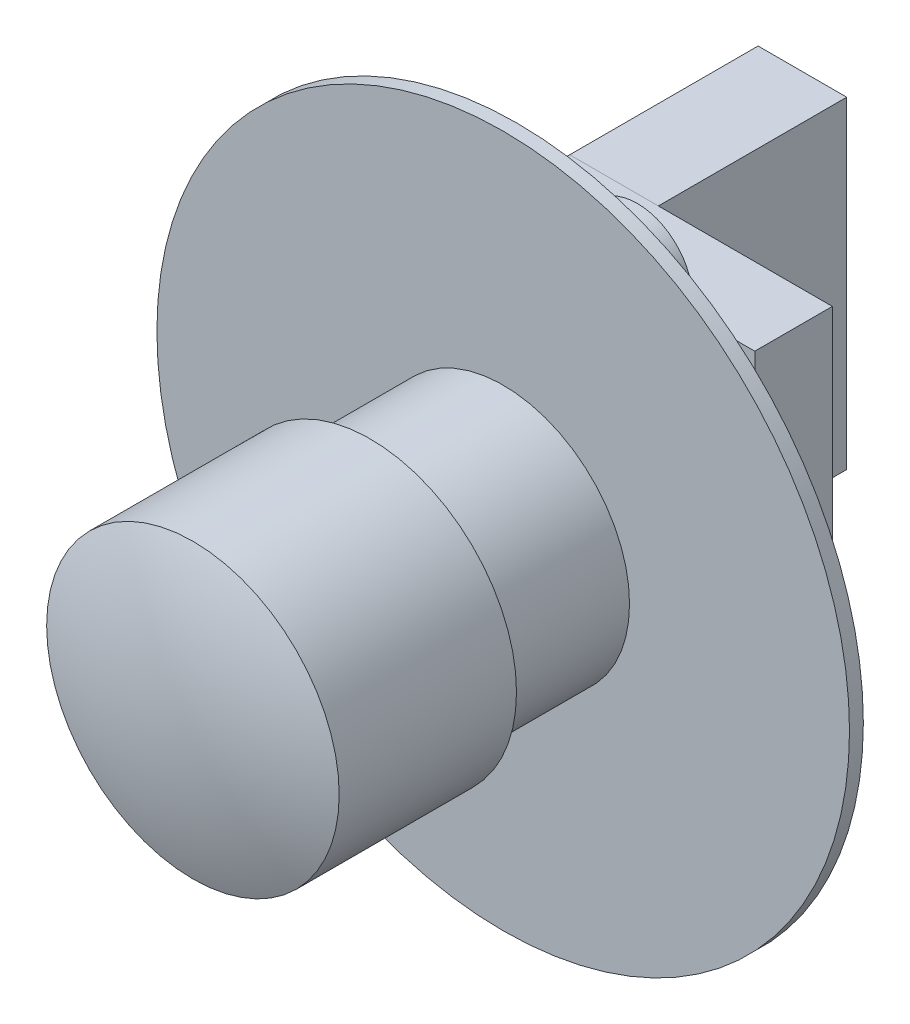
ISO-10303-21;
HEADER;
FILE_DESCRIPTION(('STEP AP214'),'2;1');
FILE_NAME('part.step','',(''),(''),'','','');
FILE_SCHEMA(('AUTOMOTIVE_DESIGN { 1 0 10303 214 1 1 1 1 }'));
ENDSEC;
DATA;
#1=APPLICATION_CONTEXT('core data for automotive mechanical design processes');
#2=APPLICATION_PROTOCOL_DEFINITION('international standard','automotive_design',2000,#1);
#3=PRODUCT_CONTEXT('',#1,'mechanical');
#4=PRODUCT('Part','Part','',(#3));
#5=PRODUCT_RELATED_PRODUCT_CATEGORY('part','',(#4));
#6=PRODUCT_DEFINITION_FORMATION('','',#4);
#7=PRODUCT_DEFINITION_CONTEXT('part definition',#1,'design');
#8=PRODUCT_DEFINITION('design','',#6,#7);
#9=PRODUCT_DEFINITION_SHAPE('','',#8);
#10=(LENGTH_UNIT() NAMED_UNIT(*) SI_UNIT(.MILLI.,.METRE.));
#11=(NAMED_UNIT(*) PLANE_ANGLE_UNIT() SI_UNIT($,.RADIAN.));
#12=(NAMED_UNIT(*) SI_UNIT($,.STERADIAN.) SOLID_ANGLE_UNIT());
#13=UNCERTAINTY_MEASURE_WITH_UNIT(LENGTH_MEASURE(1.E-05),#10,'distance_accuracy_value','');
#14=(GEOMETRIC_REPRESENTATION_CONTEXT(3) GLOBAL_UNCERTAINTY_ASSIGNED_CONTEXT((#13)) GLOBAL_UNIT_ASSIGNED_CONTEXT((#10,
#11,#12)) REPRESENTATION_CONTEXT('',''));
#15=CARTESIAN_POINT('',(0.,0.,0.));
#16=DIRECTION('',(0.,0.,1.));
#17=DIRECTION('',(1.,0.,0.));
#18=AXIS2_PLACEMENT_3D('',#15,#16,#17);
#19=CARTESIAN_POINT('',(-15.0495,18.4785,-59.4995));
#20=DIRECTION('',(1.,0.,0.));
#21=DIRECTION('',(0.,0.,-1.));
#22=AXIS2_PLACEMENT_3D('',#19,#20,#21);
#23=PLANE('',#22);
#24=DIRECTION('',(0.,1.,0.));
#25=VECTOR('',#24,1.);
#26=CARTESIAN_POINT('',(-15.0495,18.4785,-37.9095));
#27=LINE('',#26,#25);
#28=CARTESIAN_POINT('',(-15.0495,-18.4785,-37.9095));
#29=VERTEX_POINT('',#28);
#30=CARTESIAN_POINT('',(-15.0495,18.4785,-37.9095));
#31=VERTEX_POINT('',#30);
#32=EDGE_CURVE('E113',#29,#31,#27,.T.);
#33=ORIENTED_EDGE('',*,*,#32,.T.);
#34=DIRECTION('',(0.,0.,1.));
#35=VECTOR('',#34,1.);
#36=CARTESIAN_POINT('',(-15.0495,18.4785,-59.4995));
#37=LINE('',#36,#35);
#38=CARTESIAN_POINT('',(-15.0495,18.4785,-59.4995));
#39=VERTEX_POINT('',#38);
#40=EDGE_CURVE('E12',#39,#31,#37,.T.);
#41=ORIENTED_EDGE('',*,*,#40,.F.);
#42=DIRECTION('',(0.,1.,0.));
#43=VECTOR('',#42,1.);
#44=CARTESIAN_POINT('',(-15.0495,18.4785,-59.4995));
#45=LINE('',#44,#43);
#46=CARTESIAN_POINT('',(-15.0495,-18.4785,-59.4995));
#47=VERTEX_POINT('',#46);
#48=EDGE_CURVE('E101',#47,#39,#45,.T.);
#49=ORIENTED_EDGE('',*,*,#48,.F.);
#50=DIRECTION('',(0.,0.,1.));
#51=VECTOR('',#50,1.);
#52=CARTESIAN_POINT('',(-15.0495,-18.4785,-59.4995));
#53=LINE('',#52,#51);
#54=EDGE_CURVE('E109',#47,#29,#53,.T.);
#55=ORIENTED_EDGE('',*,*,#54,.T.);
#56=EDGE_LOOP('',(#33,#41,#49,#55));
#57=FACE_BOUND('',#56,.T.);
#58=ADVANCED_FACE('F50',(#57),#23,.F.);
#59=CARTESIAN_POINT('',(-15.0495,18.4785,-59.4995));
#60=DIRECTION('',(0.,-1.,0.));
#61=DIRECTION('',(0.,0.,-1.));
#62=AXIS2_PLACEMENT_3D('',#59,#60,#61);
#63=PLANE('',#62);
#64=DIRECTION('',(1.,0.,0.));
#65=VECTOR('',#64,1.);
#66=CARTESIAN_POINT('',(-15.0495,18.4785,-37.9095));
#67=LINE('',#66,#65);
#68=CARTESIAN_POINT('',(-4.88949999999999,18.4785,-37.9095));
#69=VERTEX_POINT('',#68);
#70=EDGE_CURVE('E105',#31,#69,#67,.T.);
#71=ORIENTED_EDGE('',*,*,#70,.T.);
#72=DIRECTION('',(0.,0.,1.));
#73=VECTOR('',#72,1.);
#74=CARTESIAN_POINT('',(-4.88949999999999,18.4785,-59.4995));
#75=LINE('',#74,#73);
#76=CARTESIAN_POINT('',(-4.88949999999999,18.4785,-59.4995));
#77=VERTEX_POINT('',#76);
#78=EDGE_CURVE('E58',#77,#69,#75,.T.);
#79=ORIENTED_EDGE('',*,*,#78,.F.);
#80=DIRECTION('',(1.,0.,0.));
#81=VECTOR('',#80,1.);
#82=CARTESIAN_POINT('',(-15.0495,18.4785,-59.4995));
#83=LINE('',#82,#81);
#84=EDGE_CURVE('E96',#39,#77,#83,.T.);
#85=ORIENTED_EDGE('',*,*,#84,.F.);
#86=ORIENTED_EDGE('',*,*,#40,.T.);
#87=EDGE_LOOP('',(#71,#79,#85,#86));
#88=FACE_BOUND('',#87,.T.);
#89=ADVANCED_FACE('F104',(#88),#63,.F.);
#90=CARTESIAN_POINT('',(-4.88949999999999,18.4785,-59.4995));
#91=DIRECTION('',(-1.,0.,0.));
#92=DIRECTION('',(0.,-1.,0.));
#93=AXIS2_PLACEMENT_3D('',#90,#91,#92);
#94=PLANE('',#93);
#95=DIRECTION('',(0.,-1.,0.));
#96=VECTOR('',#95,1.);
#97=CARTESIAN_POINT('',(-4.88949999999999,18.4785,-37.9095));
#98=LINE('',#97,#96);
#99=CARTESIAN_POINT('',(-4.88950000000001,-18.4785,-37.9095));
#100=VERTEX_POINT('',#99);
#101=EDGE_CURVE('E83',#69,#100,#98,.T.);
#102=ORIENTED_EDGE('',*,*,#101,.T.);
#103=DIRECTION('',(0.,0.,1.));
#104=VECTOR('',#103,1.);
#105=CARTESIAN_POINT('',(-4.88950000000001,-18.4785,-59.4995));
#106=LINE('',#105,#104);
#107=CARTESIAN_POINT('',(-4.88950000000001,-18.4785,-59.4995));
#108=VERTEX_POINT('',#107);
#109=EDGE_CURVE('E106',#108,#100,#106,.T.);
#110=ORIENTED_EDGE('',*,*,#109,.F.);
#111=DIRECTION('',(0.,-1.,0.));
#112=VECTOR('',#111,1.);
#113=CARTESIAN_POINT('',(-4.88949999999999,18.4785,-59.4995));
#114=LINE('',#113,#112);
#115=EDGE_CURVE('E99',#77,#108,#114,.T.);
#116=ORIENTED_EDGE('',*,*,#115,.F.);
#117=ORIENTED_EDGE('',*,*,#78,.T.);
#118=EDGE_LOOP('',(#102,#110,#116,#117));
#119=FACE_BOUND('',#118,.T.);
#120=ADVANCED_FACE('F107',(#119),#94,.F.);
#121=CARTESIAN_POINT('',(-15.0495,-18.4785,-59.4995));
#122=DIRECTION('',(0.,1.,0.));
#123=DIRECTION('',(0.,0.,1.));
#124=AXIS2_PLACEMENT_3D('',#121,#122,#123);
#125=PLANE('',#124);
#126=DIRECTION('',(-1.,0.,0.));
#127=VECTOR('',#126,1.);
#128=CARTESIAN_POINT('',(-15.0495,-18.4785,-37.9095));
#129=LINE('',#128,#127);
#130=EDGE_CURVE('E89',#100,#29,#129,.T.);
#131=ORIENTED_EDGE('',*,*,#130,.T.);
#132=ORIENTED_EDGE('',*,*,#54,.F.);
#133=DIRECTION('',(-1.,0.,0.));
#134=VECTOR('',#133,1.);
#135=CARTESIAN_POINT('',(-15.0495,-18.4785,-59.4995));
#136=LINE('',#135,#134);
#137=EDGE_CURVE('E66',#108,#47,#136,.T.);
#138=ORIENTED_EDGE('',*,*,#137,.F.);
#139=ORIENTED_EDGE('',*,*,#109,.T.);
#140=EDGE_LOOP('',(#131,#132,#138,#139));
#141=FACE_BOUND('',#140,.T.);
#142=ADVANCED_FACE('F120',(#141),#125,.F.);
#143=CARTESIAN_POINT('',(0.,0.,-59.4995));
#144=DIRECTION('',(0.,0.,1.));
#145=DIRECTION('',(1.,0.,0.));
#146=AXIS2_PLACEMENT_3D('',#143,#144,#145);
#147=PLANE('',#146);
#148=ORIENTED_EDGE('',*,*,#48,.T.);
#149=ORIENTED_EDGE('',*,*,#84,.T.);
#150=ORIENTED_EDGE('',*,*,#115,.T.);
#151=ORIENTED_EDGE('',*,*,#137,.T.);
#152=EDGE_LOOP('',(#148,#149,#150,#151));
#153=FACE_BOUND('',#152,.T.);
#154=ADVANCED_FACE('F97',(#153),#147,.F.);
#155=CARTESIAN_POINT('',(0.,0.,-37.9095));
#156=DIRECTION('',(0.,0.,1.));
#157=DIRECTION('',(1.,0.,0.));
#158=AXIS2_PLACEMENT_3D('',#155,#156,#157);
#159=PLANE('',#158);
#160=ORIENTED_EDGE('',*,*,#32,.F.);
#161=ORIENTED_EDGE('',*,*,#130,.F.);
#162=ORIENTED_EDGE('',*,*,#101,.F.);
#163=ORIENTED_EDGE('',*,*,#70,.F.);
#164=EDGE_LOOP('',(#160,#161,#162,#163));
#165=FACE_BOUND('',#164,.T.);
#166=ADVANCED_FACE('F123',(#165),#159,.T.);
#167=CLOSED_SHELL('',(#58,#89,#120,#142,#154,#166));
#168=MANIFOLD_SOLID_BREP('B2',#167);
#169=CARTESIAN_POINT('',(0.,0.,-16.8275));
#170=DIRECTION('',(0.,0.,-1.));
#171=DIRECTION('',(-1.,0.,0.));
#172=AXIS2_PLACEMENT_3D('',#169,#170,#171);
#173=PLANE('',#172);
#174=CARTESIAN_POINT('',(0.,0.,-16.8275));
#175=DIRECTION('',(0.,0.,-1.));
#176=DIRECTION('',(-1.,0.,0.));
#177=AXIS2_PLACEMENT_3D('',#174,#175,#176);
#178=CIRCLE('',#177,39.6875);
#179=CARTESIAN_POINT('',(-39.6875,0.,-16.8275));
#180=VERTEX_POINT('',#179);
#181=EDGE_CURVE('E283',#180,#180,#178,.T.);
#182=ORIENTED_EDGE('',*,*,#181,.T.);
#183=EDGE_LOOP('',(#182));
#184=FACE_BOUND('',#183,.T.);
#185=CARTESIAN_POINT('',(0.,0.,-16.8275));
#186=DIRECTION('',(0.,0.,-1.));
#187=DIRECTION('',(-1.,0.,0.));
#188=AXIS2_PLACEMENT_3D('',#185,#186,#187);
#189=CIRCLE('',#188,11.1125);
#190=CARTESIAN_POINT('',(-11.1125,0.,-16.8275));
#191=VERTEX_POINT('',#190);
#192=EDGE_CURVE('E274',#191,#191,#189,.T.);
#193=ORIENTED_EDGE('',*,*,#192,.F.);
#194=EDGE_LOOP('',(#193));
#195=FACE_BOUND('',#194,.T.);
#196=ADVANCED_FACE('F167',(#184,#195),#173,.T.);
#197=CARTESIAN_POINT('',(0.,0.,0.));
#198=DIRECTION('',(0.,0.,1.));
#199=DIRECTION('',(1.,0.,0.));
#200=AXIS2_PLACEMENT_3D('',#197,#198,#199);
#201=PLANE('',#200);
#202=CARTESIAN_POINT('',(0.,0.,0.));
#203=DIRECTION('',(0.,0.,1.));
#204=DIRECTION('',(1.,0.,0.));
#205=AXIS2_PLACEMENT_3D('',#202,#203,#204);
#206=CIRCLE('',#205,16.764);
#207=CARTESIAN_POINT('',(16.764,0.,0.));
#208=VERTEX_POINT('',#207);
#209=EDGE_CURVE('E291',#208,#208,#206,.T.);
#210=ORIENTED_EDGE('',*,*,#209,.F.);
#211=EDGE_LOOP('',(#210));
#212=FACE_BOUND('',#211,.T.);
#213=CARTESIAN_POINT('',(0.,0.,0.));
#214=DIRECTION('',(0.,0.,1.));
#215=DIRECTION('',(1.,0.,0.));
#216=AXIS2_PLACEMENT_3D('',#213,#214,#215);
#217=CIRCLE('',#216,14.478);
#218=CARTESIAN_POINT('',(14.478,0.,0.));
#219=VERTEX_POINT('',#218);
#220=EDGE_CURVE('E48',#219,#219,#217,.F.);
#221=ORIENTED_EDGE('',*,*,#220,.F.);
#222=EDGE_LOOP('',(#221));
#223=FACE_BOUND('',#222,.T.);
#224=ADVANCED_FACE('F297',(#212,#223),#201,.F.);
#225=CARTESIAN_POINT('',(0.,0.,20.3199999999999));
#226=DIRECTION('',(0.,0.,-1.));
#227=DIRECTION('',(-1.,0.,0.));
#228=AXIS2_PLACEMENT_3D('',#225,#226,#227);
#229=CYLINDRICAL_SURFACE('',#228,16.764);
#230=CARTESIAN_POINT('',(0.,0.,20.3199999999999));
#231=DIRECTION('',(0.,0.,1.));
#232=DIRECTION('',(1.,0.,0.));
#233=AXIS2_PLACEMENT_3D('',#230,#231,#232);
#234=CIRCLE('',#233,16.764);
#235=CARTESIAN_POINT('',(16.764,0.,20.3199999999999));
#236=VERTEX_POINT('',#235);
#237=EDGE_CURVE('E175',#236,#236,#234,.T.);
#238=ORIENTED_EDGE('',*,*,#237,.F.);
#239=EDGE_LOOP('',(#238));
#240=FACE_BOUND('',#239,.T.);
#241=ORIENTED_EDGE('',*,*,#209,.T.);
#242=EDGE_LOOP('',(#241));
#243=FACE_BOUND('',#242,.T.);
#244=ADVANCED_FACE('F169',(#240,#243),#229,.T.);
#245=CARTESIAN_POINT('',(0.,0.,-22.34946));
#246=DIRECTION('',(0.,0.,-1.));
#247=DIRECTION('',(-1.,0.,0.));
#248=AXIS2_PLACEMENT_3D('',#245,#246,#247);
#249=SPHERICAL_SURFACE('',#248,45.84446);
#250=ORIENTED_EDGE('',*,*,#237,.T.);
#251=EDGE_LOOP('',(#250));
#252=FACE_BOUND('',#251,.T.);
#253=ADVANCED_FACE('F305',(#252),#249,.T.);
#254=CARTESIAN_POINT('',(0.,0.,-15.2399999999999));
#255=DIRECTION('',(0.,0.,1.));
#256=DIRECTION('',(1.,0.,0.));
#257=AXIS2_PLACEMENT_3D('',#254,#255,#256);
#258=CYLINDRICAL_SURFACE('',#257,14.478);
#259=CARTESIAN_POINT('',(0.,0.,-15.2399999999999));
#260=DIRECTION('',(0.,0.,-1.));
#261=DIRECTION('',(-1.,0.,0.));
#262=AXIS2_PLACEMENT_3D('',#259,#260,#261);
#263=CIRCLE('',#262,14.478);
#264=CARTESIAN_POINT('',(14.478,0.,-15.2399999999999));
#265=VERTEX_POINT('',#264);
#266=EDGE_CURVE('E286',#265,#265,#263,.T.);
#267=CARTESIAN_POINT('',(14.478,0.,-15.2399999999999));
#268=CARTESIAN_POINT('',(14.478,0.,-15.0812499999999));
#269=CARTESIAN_POINT('',(14.478,0.,-14.9224999999999));
#270=CARTESIAN_POINT('',(14.478,0.,-14.6049999999999));
#271=CARTESIAN_POINT('',(14.478,0.,-14.4462499999999));
#272=CARTESIAN_POINT('',(14.478,0.,-14.1287499999999));
#273=CARTESIAN_POINT('',(14.478,0.,-13.9699999999999));
#274=CARTESIAN_POINT('',(14.478,0.,-13.6524999999999));
#275=CARTESIAN_POINT('',(14.478,0.,-13.4937499999999));
#276=CARTESIAN_POINT('',(14.478,0.,-13.1762499999999));
#277=CARTESIAN_POINT('',(14.478,0.,-13.0174999999999));
#278=CARTESIAN_POINT('',(14.478,0.,-12.6999999999999));
#279=CARTESIAN_POINT('',(14.478,0.,-12.5412499999999));
#280=CARTESIAN_POINT('',(14.478,0.,-12.2237499999999));
#281=CARTESIAN_POINT('',(14.478,0.,-12.0649999999999));
#282=CARTESIAN_POINT('',(14.478,0.,-11.7474999999999));
#283=CARTESIAN_POINT('',(14.478,0.,-11.5887499999999));
#284=CARTESIAN_POINT('',(14.478,0.,-11.2712499999999));
#285=CARTESIAN_POINT('',(14.478,0.,-11.1124999999999));
#286=CARTESIAN_POINT('',(14.478,0.,-10.7949999999999));
#287=CARTESIAN_POINT('',(14.478,0.,-10.6362499999999));
#288=CARTESIAN_POINT('',(14.478,0.,-10.3187499999999));
#289=CARTESIAN_POINT('',(14.478,0.,-10.1599999999999));
#290=CARTESIAN_POINT('',(14.478,0.,-9.84249999999995));
#291=CARTESIAN_POINT('',(14.478,0.,-9.68374999999995));
#292=CARTESIAN_POINT('',(14.478,0.,-9.36624999999995));
#293=CARTESIAN_POINT('',(14.478,0.,-9.20749999999995));
#294=CARTESIAN_POINT('',(14.478,0.,-8.88999999999995));
#295=CARTESIAN_POINT('',(14.478,0.,-8.73124999999995));
#296=CARTESIAN_POINT('',(14.478,0.,-8.41374999999995));
#297=CARTESIAN_POINT('',(14.478,0.,-8.25499999999995));
#298=CARTESIAN_POINT('',(14.478,0.,-7.93749999999996));
#299=CARTESIAN_POINT('',(14.478,0.,-7.77874999999996));
#300=CARTESIAN_POINT('',(14.478,0.,-7.46124999999996));
#301=CARTESIAN_POINT('',(14.478,0.,-7.30249999999996));
#302=CARTESIAN_POINT('',(14.478,0.,-6.98499999999996));
#303=CARTESIAN_POINT('',(14.478,0.,-6.82624999999996));
#304=CARTESIAN_POINT('',(14.478,0.,-6.50874999999997));
#305=CARTESIAN_POINT('',(14.478,0.,-6.34999999999997));
#306=CARTESIAN_POINT('',(14.478,0.,-6.03249999999997));
#307=CARTESIAN_POINT('',(14.478,0.,-5.87374999999997));
#308=CARTESIAN_POINT('',(14.478,0.,-5.55624999999997));
#309=CARTESIAN_POINT('',(14.478,0.,-5.39749999999997));
#310=CARTESIAN_POINT('',(14.478,0.,-5.07999999999997));
#311=CARTESIAN_POINT('',(14.478,0.,-4.92124999999997));
#312=CARTESIAN_POINT('',(14.478,0.,-4.60374999999998));
#313=CARTESIAN_POINT('',(14.478,0.,-4.44499999999998));
#314=CARTESIAN_POINT('',(14.478,0.,-4.12749999999998));
#315=CARTESIAN_POINT('',(14.478,0.,-3.96874999999998));
#316=CARTESIAN_POINT('',(14.478,0.,-3.65124999999998));
#317=CARTESIAN_POINT('',(14.478,0.,-3.49249999999998));
#318=CARTESIAN_POINT('',(14.478,0.,-3.17499999999998));
#319=CARTESIAN_POINT('',(14.478,0.,-3.01624999999998));
#320=CARTESIAN_POINT('',(14.478,0.,-2.69874999999998));
#321=CARTESIAN_POINT('',(14.478,0.,-2.53999999999998));
#322=CARTESIAN_POINT('',(14.478,0.,-2.22249999999999));
#323=CARTESIAN_POINT('',(14.478,0.,-2.06374999999999));
#324=CARTESIAN_POINT('',(14.478,0.,-1.74624999999999));
#325=CARTESIAN_POINT('',(14.478,0.,-1.58749999999999));
#326=CARTESIAN_POINT('',(14.478,0.,-1.26999999999999));
#327=CARTESIAN_POINT('',(14.478,0.,-1.11124999999999));
#328=CARTESIAN_POINT('',(14.478,0.,-0.793749999999994));
#329=CARTESIAN_POINT('',(14.478,0.,-0.634999999999995));
#330=CARTESIAN_POINT('',(14.478,0.,-0.317499999999997));
#331=CARTESIAN_POINT('',(14.478,0.,-0.158749999999997));
#332=CARTESIAN_POINT('',(14.478,0.,0.));
#333=B_SPLINE_CURVE_WITH_KNOTS('',3,(#267,#268,#269,#270,#271,#272,#273,#274,#275,#276,#277,
#278,#279,#280,#281,#282,#283,#284,#285,#286,#287,#288,#289,#290,#291,#292,#293,#294,#295,#296,
#297,#298,#299,#300,#301,#302,#303,#304,#305,#306,#307,#308,#309,#310,#311,#312,#313,#314,#315,
#316,#317,#318,#319,#320,#321,#322,#323,#324,#325,#326,#327,#328,#329,#330,#331,#332),
.UNSPECIFIED.,.F.,.F.,(4,2,2,2,2,2,2,2,2,2,2,2,2,2,2,2,2,2,2,2,2,2,2,2,2,2,2,2,2,2,2,2,4),(0.,
0.476249999999999,0.952499999999997,1.42874999999999,1.90499999999999,2.38124999999999,
2.85749999999999,3.33374999999998,3.80999999999998,4.28624999999998,4.76249999999998,
5.23874999999997,5.71499999999997,6.19124999999997,6.66749999999997,7.14374999999996,
7.61999999999996,8.09624999999996,8.57249999999996,9.04874999999995,9.52499999999995,
10.0012499999999,10.4774999999999,10.9537499999999,11.4299999999999,11.9062499999999,
12.3824999999999,12.8587499999999,13.3349999999999,13.8112499999999,14.2874999999999,
14.7637499999999,15.2399999999999),.UNSPECIFIED.);
#334=EDGE_CURVE('BSEAM302',#265,#219,#333,.T.);
#335=ORIENTED_EDGE('',*,*,#266,.F.);
#336=ORIENTED_EDGE('',*,*,#220,.T.);
#337=ORIENTED_EDGE('',*,*,#334,.T.);
#338=ORIENTED_EDGE('',*,*,#334,.F.);
#339=EDGE_LOOP('',(#335,#337,#336,#338));
#340=FACE_BOUND('',#339,.T.);
#341=ADVANCED_FACE('F302',(#340),#258,.T.);
#342=CARTESIAN_POINT('',(0.,0.,-15.2399999999999));
#343=DIRECTION('',(0.,0.,-1.));
#344=DIRECTION('',(-1.,0.,0.));
#345=AXIS2_PLACEMENT_3D('',#342,#343,#344);
#346=PLANE('',#345);
#347=CARTESIAN_POINT('',(0.,0.,-15.2399999999999));
#348=DIRECTION('',(0.,0.,-1.));
#349=DIRECTION('',(-1.,0.,0.));
#350=AXIS2_PLACEMENT_3D('',#347,#348,#349);
#351=CIRCLE('',#350,39.6875);
#352=CARTESIAN_POINT('',(-39.6875,0.,-15.2399999999999));
#353=VERTEX_POINT('',#352);
#354=EDGE_CURVE('E280',#353,#353,#351,.T.);
#355=ORIENTED_EDGE('',*,*,#354,.F.);
#356=EDGE_LOOP('',(#355));
#357=FACE_BOUND('',#356,.T.);
#358=ORIENTED_EDGE('',*,*,#266,.T.);
#359=EDGE_LOOP('',(#358));
#360=FACE_BOUND('',#359,.T.);
#361=ADVANCED_FACE('F304',(#357,#360),#346,.F.);
#362=CARTESIAN_POINT('',(0.,0.,-16.8275));
#363=DIRECTION('',(0.,0.,1.));
#364=DIRECTION('',(1.,0.,0.));
#365=AXIS2_PLACEMENT_3D('',#362,#363,#364);
#366=CYLINDRICAL_SURFACE('',#365,39.6875);
#367=ORIENTED_EDGE('',*,*,#181,.F.);
#368=EDGE_LOOP('',(#367));
#369=FACE_BOUND('',#368,.T.);
#370=ORIENTED_EDGE('',*,*,#354,.T.);
#371=EDGE_LOOP('',(#370));
#372=FACE_BOUND('',#371,.T.);
#373=ADVANCED_FACE('F312',(#369,#372),#366,.T.);
#374=CARTESIAN_POINT('',(0.,0.,-23.1775000000001));
#375=DIRECTION('',(0.,0.,1.));
#376=DIRECTION('',(1.,0.,0.));
#377=AXIS2_PLACEMENT_3D('',#374,#375,#376);
#378=CYLINDRICAL_SURFACE('',#377,11.1125);
#379=CARTESIAN_POINT('',(0.,0.,-23.1775000000001));
#380=DIRECTION('',(0.,0.,-1.));
#381=DIRECTION('',(-1.,0.,0.));
#382=AXIS2_PLACEMENT_3D('',#379,#380,#381);
#383=CIRCLE('',#382,11.1125);
#384=CARTESIAN_POINT('',(-11.1125,0.,-23.1775000000001));
#385=VERTEX_POINT('',#384);
#386=EDGE_CURVE('E277',#385,#385,#383,.T.);
#387=ORIENTED_EDGE('',*,*,#386,.F.);
#388=EDGE_LOOP('',(#387));
#389=FACE_BOUND('',#388,.T.);
#390=ORIENTED_EDGE('',*,*,#192,.T.);
#391=EDGE_LOOP('',(#390));
#392=FACE_BOUND('',#391,.T.);
#393=ADVANCED_FACE('F326',(#389,#392),#378,.T.);
#394=CARTESIAN_POINT('',(0.,0.,-23.1775000000001));
#395=DIRECTION('',(0.,0.,-1.));
#396=DIRECTION('',(-1.,0.,0.));
#397=AXIS2_PLACEMENT_3D('',#394,#395,#396);
#398=PLANE('',#397);
#399=CARTESIAN_POINT('',(0.,0.,-23.1775000000001));
#400=DIRECTION('',(0.,0.,-1.));
#401=DIRECTION('',(-1.,0.,0.));
#402=AXIS2_PLACEMENT_3D('',#399,#400,#401);
#403=CIRCLE('',#402,14.605);
#404=CARTESIAN_POINT('',(-14.605,0.,-23.1775000000001));
#405=VERTEX_POINT('',#404);
#406=EDGE_CURVE('E270',#405,#405,#403,.T.);
#407=ORIENTED_EDGE('',*,*,#406,.F.);
#408=EDGE_LOOP('',(#407));
#409=FACE_BOUND('',#408,.T.);
#410=ORIENTED_EDGE('',*,*,#386,.T.);
#411=EDGE_LOOP('',(#410));
#412=FACE_BOUND('',#411,.T.);
#413=ADVANCED_FACE('F333',(#409,#412),#398,.F.);
#414=CARTESIAN_POINT('',(0.,0.,-29.0195));
#415=DIRECTION('',(0.,0.,1.));
#416=DIRECTION('',(1.,0.,0.));
#417=AXIS2_PLACEMENT_3D('',#414,#415,#416);
#418=CYLINDRICAL_SURFACE('',#417,14.605);
#419=CARTESIAN_POINT('',(0.,0.,-29.0195));
#420=DIRECTION('',(0.,0.,-1.));
#421=DIRECTION('',(-1.,0.,0.));
#422=AXIS2_PLACEMENT_3D('',#419,#420,#421);
#423=CIRCLE('',#422,14.605);
#424=CARTESIAN_POINT('',(-14.605,0.,-29.0195));
#425=VERTEX_POINT('',#424);
#426=EDGE_CURVE('E271',#425,#425,#423,.T.);
#427=ORIENTED_EDGE('',*,*,#426,.F.);
#428=EDGE_LOOP('',(#427));
#429=FACE_BOUND('',#428,.T.);
#430=ORIENTED_EDGE('',*,*,#406,.T.);
#431=EDGE_LOOP('',(#430));
#432=FACE_BOUND('',#431,.T.);
#433=ADVANCED_FACE('F342',(#429,#432),#418,.T.);
#434=CARTESIAN_POINT('',(0.,0.,-29.0195));
#435=DIRECTION('',(0.,0.,-1.));
#436=DIRECTION('',(-1.,0.,0.));
#437=AXIS2_PLACEMENT_3D('',#434,#435,#436);
#438=PLANE('',#437);
#439=DIRECTION('',(0.,1.,0.));
#440=VECTOR('',#439,1.);
#441=CARTESIAN_POINT('',(-15.0495,18.4785,-29.0195));
#442=LINE('',#441,#440);
#443=CARTESIAN_POINT('',(-15.0495,-18.4785,-29.0195));
#444=VERTEX_POINT('',#443);
#445=CARTESIAN_POINT('',(-15.0495,18.4785,-29.0195));
#446=VERTEX_POINT('',#445);
#447=EDGE_CURVE('E231',#444,#446,#442,.T.);
#448=ORIENTED_EDGE('',*,*,#447,.F.);
#449=DIRECTION('',(-1.,0.,0.));
#450=VECTOR('',#449,1.);
#451=CARTESIAN_POINT('',(15.0495,-18.4785,-29.0195));
#452=LINE('',#451,#450);
#453=CARTESIAN_POINT('',(15.0495,-18.4785,-29.0195));
#454=VERTEX_POINT('',#453);
#455=EDGE_CURVE('E249',#454,#444,#452,.T.);
#456=ORIENTED_EDGE('',*,*,#455,.F.);
#457=DIRECTION('',(0.,-1.,0.));
#458=VECTOR('',#457,1.);
#459=CARTESIAN_POINT('',(15.0495,18.4785,-29.0195));
#460=LINE('',#459,#458);
#461=CARTESIAN_POINT('',(15.0495,18.4785,-29.0195));
#462=VERTEX_POINT('',#461);
#463=EDGE_CURVE('E227',#462,#454,#460,.T.);
#464=ORIENTED_EDGE('',*,*,#463,.F.);
#465=DIRECTION('',(1.,0.,0.));
#466=VECTOR('',#465,1.);
#467=CARTESIAN_POINT('',(15.0495,18.4785,-29.0195));
#468=LINE('',#467,#466);
#469=CARTESIAN_POINT('',(6.35000000000001,18.4785,-29.0195));
#470=VERTEX_POINT('',#469);
#471=EDGE_CURVE('E220',#470,#462,#468,.T.);
#472=ORIENTED_EDGE('',*,*,#471,.F.);
#473=CARTESIAN_POINT('',(0.,18.4785,-29.0195));
#474=DIRECTION('',(0.,0.,1.));
#475=DIRECTION('',(-1.,0.,0.));
#476=AXIS2_PLACEMENT_3D('',#473,#474,#475);
#477=CIRCLE('',#476,6.35);
#478=CARTESIAN_POINT('',(-6.34999999999999,18.4785,-29.0195));
#479=VERTEX_POINT('',#478);
#480=EDGE_CURVE('E225',#470,#479,#477,.T.);
#481=ORIENTED_EDGE('',*,*,#480,.T.);
#482=EDGE_CURVE('E230',#446,#479,#468,.T.);
#483=ORIENTED_EDGE('',*,*,#482,.F.);
#484=EDGE_LOOP('',(#448,#456,#464,#472,#481,#483));
#485=FACE_BOUND('',#484,.T.);
#486=ORIENTED_EDGE('',*,*,#426,.T.);
#487=EDGE_LOOP('',(#486));
#488=FACE_BOUND('',#487,.T.);
#489=ADVANCED_FACE('F222',(#485,#488),#438,.F.);
#490=CARTESIAN_POINT('',(-15.0495,18.4785,-37.9095));
#491=DIRECTION('',(1.,0.,0.));
#492=DIRECTION('',(0.,1.,0.));
#493=AXIS2_PLACEMENT_3D('',#490,#491,#492);
#494=PLANE('',#493);
#495=ORIENTED_EDGE('',*,*,#447,.T.);
#496=DIRECTION('',(0.,0.,1.));
#497=VECTOR('',#496,1.);
#498=CARTESIAN_POINT('',(-15.0495,18.4785,-37.9095));
#499=LINE('',#498,#497);
#500=CARTESIAN_POINT('',(-15.0495,18.4785,-37.9095));
#501=VERTEX_POINT('',#500);
#502=EDGE_CURVE('E267',#501,#446,#499,.T.);
#503=ORIENTED_EDGE('',*,*,#502,.F.);
#504=DIRECTION('',(0.,1.,0.));
#505=VECTOR('',#504,1.);
#506=CARTESIAN_POINT('',(-15.0495,18.4785,-37.9095));
#507=LINE('',#506,#505);
#508=CARTESIAN_POINT('',(-15.0495,-18.4785,-37.9095));
#509=VERTEX_POINT('',#508);
#510=EDGE_CURVE('E245',#509,#501,#507,.T.);
#511=ORIENTED_EDGE('',*,*,#510,.F.);
#512=DIRECTION('',(0.,0.,1.));
#513=VECTOR('',#512,1.);
#514=CARTESIAN_POINT('',(-15.0495,-18.4785,-37.9095));
#515=LINE('',#514,#513);
#516=EDGE_CURVE('E255',#509,#444,#515,.T.);
#517=ORIENTED_EDGE('',*,*,#516,.T.);
#518=EDGE_LOOP('',(#495,#503,#511,#517));
#519=FACE_BOUND('',#518,.T.);
#520=ADVANCED_FACE('F355',(#519),#494,.F.);
#521=CARTESIAN_POINT('',(15.0495,18.4785,-37.9095));
#522=DIRECTION('',(0.,-1.,0.));
#523=DIRECTION('',(0.,0.,-1.));
#524=AXIS2_PLACEMENT_3D('',#521,#522,#523);
#525=PLANE('',#524);
#526=DIRECTION('',(1.,0.,0.));
#527=VECTOR('',#526,1.);
#528=CARTESIAN_POINT('',(6.35000000000001,18.4785,-30.607));
#529=LINE('',#528,#527);
#530=CARTESIAN_POINT('',(-6.34999999999999,18.4785,-30.607));
#531=VERTEX_POINT('',#530);
#532=CARTESIAN_POINT('',(6.35000000000001,18.4785,-30.607));
#533=VERTEX_POINT('',#532);
#534=EDGE_CURVE('E182',#531,#533,#529,.T.);
#535=ORIENTED_EDGE('',*,*,#534,.T.);
#536=DIRECTION('',(0.,0.,1.));
#537=VECTOR('',#536,1.);
#538=CARTESIAN_POINT('',(6.35000000000001,18.4785,-30.607));
#539=LINE('',#538,#537);
#540=EDGE_CURVE('E233',#533,#470,#539,.T.);
#541=ORIENTED_EDGE('',*,*,#540,.T.);
#542=ORIENTED_EDGE('',*,*,#471,.T.);
#543=DIRECTION('',(0.,0.,1.));
#544=VECTOR('',#543,1.);
#545=CARTESIAN_POINT('',(15.0495,18.4785,-37.9095));
#546=LINE('',#545,#544);
#547=CARTESIAN_POINT('',(15.0495,18.4785,-37.9095));
#548=VERTEX_POINT('',#547);
#549=EDGE_CURVE('E265',#548,#462,#546,.T.);
#550=ORIENTED_EDGE('',*,*,#549,.F.);
#551=DIRECTION('',(1.,0.,0.));
#552=VECTOR('',#551,1.);
#553=CARTESIAN_POINT('',(15.0495,18.4785,-37.9095));
#554=LINE('',#553,#552);
#555=EDGE_CURVE('E248',#501,#548,#554,.T.);
#556=ORIENTED_EDGE('',*,*,#555,.F.);
#557=ORIENTED_EDGE('',*,*,#502,.T.);
#558=ORIENTED_EDGE('',*,*,#482,.T.);
#559=DIRECTION('',(0.,0.,1.));
#560=VECTOR('',#559,1.);
#561=CARTESIAN_POINT('',(-6.35000000000001,18.4785,-30.607));
#562=LINE('',#561,#560);
#563=EDGE_CURVE('E187',#531,#479,#562,.T.);
#564=ORIENTED_EDGE('',*,*,#563,.F.);
#565=EDGE_LOOP('',(#535,#541,#542,#550,#556,#557,#558,#564));
#566=FACE_BOUND('',#565,.T.);
#567=ADVANCED_FACE('F234',(#566),#525,.F.);
#568=CARTESIAN_POINT('',(15.0495,18.4785,-37.9095));
#569=DIRECTION('',(-1.,0.,0.));
#570=DIRECTION('',(0.,-1.,0.));
#571=AXIS2_PLACEMENT_3D('',#568,#569,#570);
#572=PLANE('',#571);
#573=ORIENTED_EDGE('',*,*,#463,.T.);
#574=DIRECTION('',(0.,0.,1.));
#575=VECTOR('',#574,1.);
#576=CARTESIAN_POINT('',(15.0495,-18.4785,-37.9095));
#577=LINE('',#576,#575);
#578=CARTESIAN_POINT('',(15.0495,-18.4785,-37.9095));
#579=VERTEX_POINT('',#578);
#580=EDGE_CURVE('E262',#579,#454,#577,.T.);
#581=ORIENTED_EDGE('',*,*,#580,.F.);
#582=DIRECTION('',(0.,-1.,0.));
#583=VECTOR('',#582,1.);
#584=CARTESIAN_POINT('',(15.0495,18.4785,-37.9095));
#585=LINE('',#584,#583);
#586=EDGE_CURVE('E251',#548,#579,#585,.T.);
#587=ORIENTED_EDGE('',*,*,#586,.F.);
#588=ORIENTED_EDGE('',*,*,#549,.T.);
#589=EDGE_LOOP('',(#573,#581,#587,#588));
#590=FACE_BOUND('',#589,.T.);
#591=ADVANCED_FACE('F361',(#590),#572,.F.);
#592=CARTESIAN_POINT('',(15.0495,-18.4785,-37.9095));
#593=DIRECTION('',(0.,1.,0.));
#594=DIRECTION('',(0.,0.,1.));
#595=AXIS2_PLACEMENT_3D('',#592,#593,#594);
#596=PLANE('',#595);
#597=ORIENTED_EDGE('',*,*,#455,.T.);
#598=ORIENTED_EDGE('',*,*,#516,.F.);
#599=DIRECTION('',(-1.,0.,0.));
#600=VECTOR('',#599,1.);
#601=CARTESIAN_POINT('',(15.0495,-18.4785,-37.9095));
#602=LINE('',#601,#600);
#603=EDGE_CURVE('E253',#579,#509,#602,.T.);
#604=ORIENTED_EDGE('',*,*,#603,.F.);
#605=ORIENTED_EDGE('',*,*,#580,.T.);
#606=EDGE_LOOP('',(#597,#598,#604,#605));
#607=FACE_BOUND('',#606,.T.);
#608=ADVANCED_FACE('F364',(#607),#596,.F.);
#609=CARTESIAN_POINT('',(0.,0.,-37.9095));
#610=DIRECTION('',(0.,0.,-1.));
#611=DIRECTION('',(-1.,0.,0.));
#612=AXIS2_PLACEMENT_3D('',#609,#610,#611);
#613=PLANE('',#612);
#614=ORIENTED_EDGE('',*,*,#510,.T.);
#615=ORIENTED_EDGE('',*,*,#555,.T.);
#616=ORIENTED_EDGE('',*,*,#586,.T.);
#617=ORIENTED_EDGE('',*,*,#603,.T.);
#618=EDGE_LOOP('',(#614,#615,#616,#617));
#619=FACE_BOUND('',#618,.T.);
#620=ADVANCED_FACE('F368',(#619),#613,.T.);
#621=CARTESIAN_POINT('',(0.,18.4785,-30.607));
#622=DIRECTION('',(0.,0.,1.));
#623=DIRECTION('',(1.,0.,0.));
#624=AXIS2_PLACEMENT_3D('',#621,#622,#623);
#625=CYLINDRICAL_SURFACE('',#624,6.35);
#626=ORIENTED_EDGE('',*,*,#480,.F.);
#627=ORIENTED_EDGE('',*,*,#540,.F.);
#628=CARTESIAN_POINT('',(0.,18.4785,-30.607));
#629=DIRECTION('',(0.,0.,1.));
#630=DIRECTION('',(-1.,0.,0.));
#631=AXIS2_PLACEMENT_3D('',#628,#629,#630);
#632=CIRCLE('',#631,6.35);
#633=EDGE_CURVE('E239',#533,#531,#632,.T.);
#634=ORIENTED_EDGE('',*,*,#633,.T.);
#635=ORIENTED_EDGE('',*,*,#563,.T.);
#636=EDGE_LOOP('',(#626,#627,#634,#635));
#637=FACE_BOUND('',#636,.T.);
#638=ADVANCED_FACE('F238',(#637),#625,.T.);
#639=CARTESIAN_POINT('',(0.,18.4785,-30.607));
#640=DIRECTION('',(0.,0.,-1.));
#641=DIRECTION('',(-1.,0.,0.));
#642=AXIS2_PLACEMENT_3D('',#639,#640,#641);
#643=PLANE('',#642);
#644=ORIENTED_EDGE('',*,*,#633,.F.);
#645=ORIENTED_EDGE('',*,*,#534,.F.);
#646=EDGE_LOOP('',(#644,#645));
#647=FACE_BOUND('',#646,.T.);
#648=ADVANCED_FACE('F377',(#647),#643,.T.);
#649=CLOSED_SHELL('',(#196,#224,#244,#253,#341,#361,#373,#393,#413,#433,#489,#520,#567,#591,
#608,#620,#638,#648));
#650=MANIFOLD_SOLID_BREP('B6',#649);
#651=ADVANCED_BREP_SHAPE_REPRESENTATION('',(#18,#168,#650),#14);
#652=SHAPE_DEFINITION_REPRESENTATION(#9,#651);
ENDSEC;
END-ISO-10303-21;
